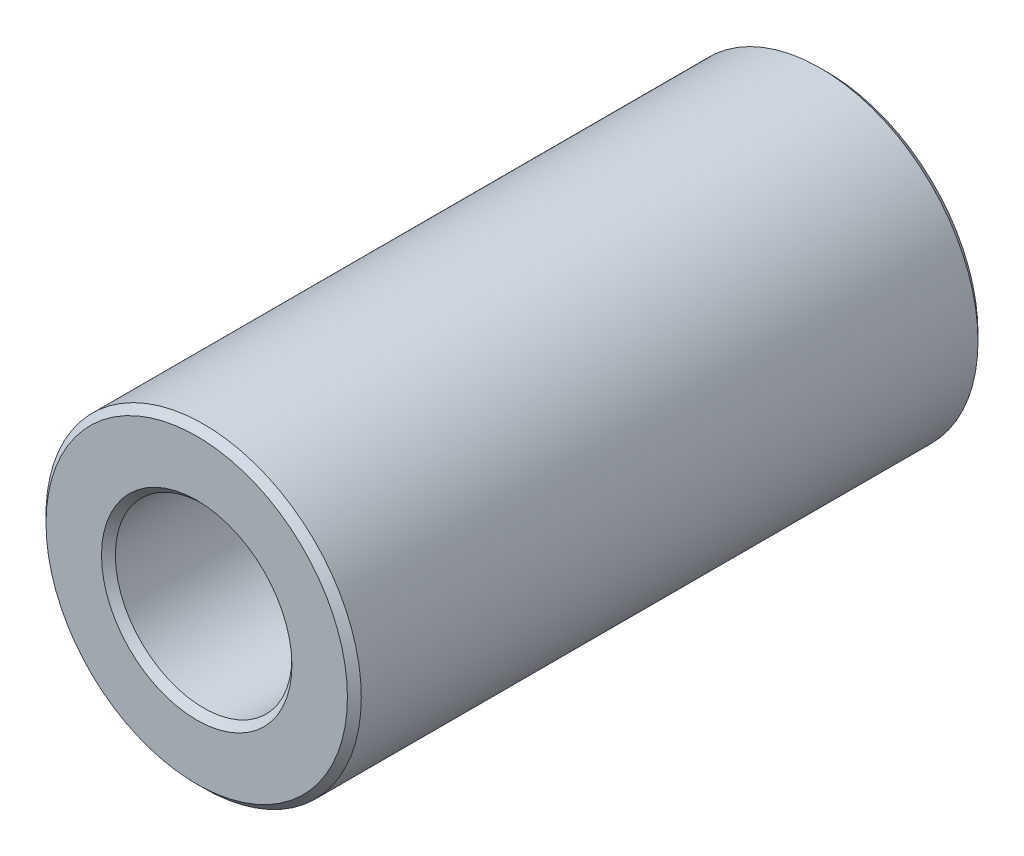
ISO-10303-21;
HEADER;
FILE_DESCRIPTION(('STEP AP214'),'2;1');
FILE_NAME('part.step','',(''),(''),'','','');
FILE_SCHEMA(('AUTOMOTIVE_DESIGN { 1 0 10303 214 1 1 1 1 }'));
ENDSEC;
DATA;
#1=APPLICATION_CONTEXT('core data for automotive mechanical design processes');
#2=APPLICATION_PROTOCOL_DEFINITION('international standard','automotive_design',2000,#1);
#3=PRODUCT_CONTEXT('',#1,'mechanical');
#4=PRODUCT('Part','Part','',(#3));
#5=PRODUCT_RELATED_PRODUCT_CATEGORY('part','',(#4));
#6=PRODUCT_DEFINITION_FORMATION('','',#4);
#7=PRODUCT_DEFINITION_CONTEXT('part definition',#1,'design');
#8=PRODUCT_DEFINITION('design','',#6,#7);
#9=PRODUCT_DEFINITION_SHAPE('','',#8);
#10=(LENGTH_UNIT() NAMED_UNIT(*) SI_UNIT(.MILLI.,.METRE.));
#11=(NAMED_UNIT(*) PLANE_ANGLE_UNIT() SI_UNIT($,.RADIAN.));
#12=(NAMED_UNIT(*) SI_UNIT($,.STERADIAN.) SOLID_ANGLE_UNIT());
#13=UNCERTAINTY_MEASURE_WITH_UNIT(LENGTH_MEASURE(1.E-05),#10,'distance_accuracy_value','');
#14=(GEOMETRIC_REPRESENTATION_CONTEXT(3) GLOBAL_UNCERTAINTY_ASSIGNED_CONTEXT((#13)) GLOBAL_UNIT_ASSIGNED_CONTEXT((#10,
#11,#12)) REPRESENTATION_CONTEXT('',''));
#15=CARTESIAN_POINT('',(0.,0.,0.));
#16=DIRECTION('',(0.,0.,1.));
#17=DIRECTION('',(1.,0.,0.));
#18=AXIS2_PLACEMENT_3D('',#15,#16,#17);
#19=CARTESIAN_POINT('',(0.,0.,-6.35));
#20=DIRECTION('',(0.,0.,1.));
#21=DIRECTION('',(1.,0.,0.));
#22=AXIS2_PLACEMENT_3D('',#19,#20,#21);
#23=CYLINDRICAL_SURFACE('',#22,3.175);
#24=CARTESIAN_POINT('',(0.,0.,6.2103));
#25=DIRECTION('',(0.,0.,1.));
#26=DIRECTION('',(1.,0.,0.));
#27=AXIS2_PLACEMENT_3D('',#24,#25,#26);
#28=CIRCLE('',#27,3.175);
#29=CARTESIAN_POINT('',(3.175,0.,6.2103));
#30=VERTEX_POINT('',#29);
#31=EDGE_CURVE('E54',#30,#30,#28,.F.);
#32=ORIENTED_EDGE('',*,*,#31,.T.);
#33=EDGE_LOOP('',(#32));
#34=FACE_BOUND('',#33,.T.);
#35=CARTESIAN_POINT('',(0.,0.,-6.2103));
#36=DIRECTION('',(0.,0.,1.));
#37=DIRECTION('',(1.,0.,0.));
#38=AXIS2_PLACEMENT_3D('',#35,#36,#37);
#39=CIRCLE('',#38,3.175);
#40=CARTESIAN_POINT('',(3.175,0.,-6.2103));
#41=VERTEX_POINT('',#40);
#42=EDGE_CURVE('E57',#41,#41,#39,.T.);
#43=ORIENTED_EDGE('',*,*,#42,.T.);
#44=EDGE_LOOP('',(#43));
#45=FACE_BOUND('',#44,.T.);
#46=ADVANCED_FACE('F34',(#34,#45),#23,.T.);
#47=CARTESIAN_POINT('',(0.,0.,-6.35));
#48=DIRECTION('',(0.,0.,1.));
#49=DIRECTION('',(1.,0.,0.));
#50=AXIS2_PLACEMENT_3D('',#47,#48,#49);
#51=PLANE('',#50);
#52=CARTESIAN_POINT('',(0.,0.,-6.35));
#53=DIRECTION('',(0.,0.,1.));
#54=DIRECTION('',(1.,0.,0.));
#55=AXIS2_PLACEMENT_3D('',#52,#53,#54);
#56=CIRCLE('',#55,3.0353);
#57=CARTESIAN_POINT('',(3.0353,0.,-6.35));
#58=VERTEX_POINT('',#57);
#59=EDGE_CURVE('E45',#58,#58,#56,.F.);
#60=ORIENTED_EDGE('',*,*,#59,.T.);
#61=EDGE_LOOP('',(#60));
#62=FACE_BOUND('',#61,.T.);
#63=CARTESIAN_POINT('',(0.,0.,-6.35));
#64=DIRECTION('',(0.,0.,1.));
#65=DIRECTION('',(1.,0.,0.));
#66=AXIS2_PLACEMENT_3D('',#63,#64,#65);
#67=CIRCLE('',#66,1.9177);
#68=CARTESIAN_POINT('',(1.9177,0.,-6.35));
#69=VERTEX_POINT('',#68);
#70=EDGE_CURVE('E49',#69,#69,#67,.T.);
#71=ORIENTED_EDGE('',*,*,#70,.T.);
#72=EDGE_LOOP('',(#71));
#73=FACE_BOUND('',#72,.T.);
#74=ADVANCED_FACE('F82',(#62,#73),#51,.F.);
#75=CARTESIAN_POINT('',(0.,0.,-6.35));
#76=DIRECTION('',(0.,0.,1.));
#77=DIRECTION('',(1.,0.,0.));
#78=AXIS2_PLACEMENT_3D('',#75,#76,#77);
#79=CYLINDRICAL_SURFACE('',#78,1.778);
#80=CARTESIAN_POINT('',(0.,0.,6.2103));
#81=DIRECTION('',(0.,0.,1.));
#82=DIRECTION('',(1.,0.,0.));
#83=AXIS2_PLACEMENT_3D('',#80,#81,#82);
#84=CIRCLE('',#83,1.778);
#85=CARTESIAN_POINT('',(1.778,0.,6.2103));
#86=VERTEX_POINT('',#85);
#87=EDGE_CURVE('E10',#86,#86,#84,.T.);
#88=CARTESIAN_POINT('',(0.,0.,-6.2103));
#89=DIRECTION('',(0.,0.,1.));
#90=DIRECTION('',(1.,0.,0.));
#91=AXIS2_PLACEMENT_3D('',#88,#89,#90);
#92=CIRCLE('',#91,1.778);
#93=CARTESIAN_POINT('',(1.778,0.,-6.2103));
#94=VERTEX_POINT('',#93);
#95=EDGE_CURVE('E41',#94,#94,#92,.F.);
#96=CARTESIAN_POINT('',(1.778,0.,6.2103));
#97=CARTESIAN_POINT('',(1.778,0.,6.08091875));
#98=CARTESIAN_POINT('',(1.778,0.,5.9515375));
#99=CARTESIAN_POINT('',(1.778,0.,5.692775));
#100=CARTESIAN_POINT('',(1.778,0.,5.56339375));
#101=CARTESIAN_POINT('',(1.778,0.,5.30463125));
#102=CARTESIAN_POINT('',(1.778,0.,5.17525));
#103=CARTESIAN_POINT('',(1.778,0.,4.9164875));
#104=CARTESIAN_POINT('',(1.778,0.,4.78710625));
#105=CARTESIAN_POINT('',(1.778,0.,4.52834375));
#106=CARTESIAN_POINT('',(1.778,0.,4.3989625));
#107=CARTESIAN_POINT('',(1.778,0.,4.1402));
#108=CARTESIAN_POINT('',(1.778,0.,4.01081875));
#109=CARTESIAN_POINT('',(1.778,0.,3.75205625));
#110=CARTESIAN_POINT('',(1.778,0.,3.622675));
#111=CARTESIAN_POINT('',(1.778,0.,3.3639125));
#112=CARTESIAN_POINT('',(1.778,0.,3.23453125));
#113=CARTESIAN_POINT('',(1.778,0.,2.97576875));
#114=CARTESIAN_POINT('',(1.778,0.,2.8463875));
#115=CARTESIAN_POINT('',(1.778,0.,2.587625));
#116=CARTESIAN_POINT('',(1.778,0.,2.45824375));
#117=CARTESIAN_POINT('',(1.778,0.,2.19948125));
#118=CARTESIAN_POINT('',(1.778,0.,2.0701));
#119=CARTESIAN_POINT('',(1.778,0.,1.8113375));
#120=CARTESIAN_POINT('',(1.778,0.,1.68195625));
#121=CARTESIAN_POINT('',(1.778,0.,1.42319375));
#122=CARTESIAN_POINT('',(1.778,0.,1.2938125));
#123=CARTESIAN_POINT('',(1.778,0.,1.03505));
#124=CARTESIAN_POINT('',(1.778,0.,0.90566875));
#125=CARTESIAN_POINT('',(1.778,0.,0.64690625));
#126=CARTESIAN_POINT('',(1.778,0.,0.517525));
#127=CARTESIAN_POINT('',(1.778,0.,0.2587625));
#128=CARTESIAN_POINT('',(1.778,0.,0.12938125));
#129=CARTESIAN_POINT('',(1.778,0.,-0.12938125));
#130=CARTESIAN_POINT('',(1.778,0.,-0.2587625));
#131=CARTESIAN_POINT('',(1.778,0.,-0.517525));
#132=CARTESIAN_POINT('',(1.778,0.,-0.64690625));
#133=CARTESIAN_POINT('',(1.778,0.,-0.90566875));
#134=CARTESIAN_POINT('',(1.778,0.,-1.03505));
#135=CARTESIAN_POINT('',(1.778,0.,-1.2938125));
#136=CARTESIAN_POINT('',(1.778,0.,-1.42319375));
#137=CARTESIAN_POINT('',(1.778,0.,-1.68195625));
#138=CARTESIAN_POINT('',(1.778,0.,-1.8113375));
#139=CARTESIAN_POINT('',(1.778,0.,-2.0701));
#140=CARTESIAN_POINT('',(1.778,0.,-2.19948125));
#141=CARTESIAN_POINT('',(1.778,0.,-2.45824375));
#142=CARTESIAN_POINT('',(1.778,0.,-2.587625));
#143=CARTESIAN_POINT('',(1.778,0.,-2.8463875));
#144=CARTESIAN_POINT('',(1.778,0.,-2.97576875));
#145=CARTESIAN_POINT('',(1.778,0.,-3.23453125));
#146=CARTESIAN_POINT('',(1.778,0.,-3.3639125));
#147=CARTESIAN_POINT('',(1.778,0.,-3.622675));
#148=CARTESIAN_POINT('',(1.778,0.,-3.75205625));
#149=CARTESIAN_POINT('',(1.778,0.,-4.01081875));
#150=CARTESIAN_POINT('',(1.778,0.,-4.1402));
#151=CARTESIAN_POINT('',(1.778,0.,-4.3989625));
#152=CARTESIAN_POINT('',(1.778,0.,-4.52834375));
#153=CARTESIAN_POINT('',(1.778,0.,-4.78710625));
#154=CARTESIAN_POINT('',(1.778,0.,-4.9164875));
#155=CARTESIAN_POINT('',(1.778,0.,-5.17525));
#156=CARTESIAN_POINT('',(1.778,0.,-5.30463125));
#157=CARTESIAN_POINT('',(1.778,0.,-5.56339375));
#158=CARTESIAN_POINT('',(1.778,0.,-5.692775));
#159=CARTESIAN_POINT('',(1.778,0.,-5.9515375));
#160=CARTESIAN_POINT('',(1.778,0.,-6.08091875));
#161=CARTESIAN_POINT('',(1.778,0.,-6.2103));
#162=B_SPLINE_CURVE_WITH_KNOTS('',3,(#96,#97,#98,#99,#100,#101,#102,#103,#104,#105,#106,#107,
#108,#109,#110,#111,#112,#113,#114,#115,#116,#117,#118,#119,#120,#121,#122,#123,#124,#125,#126,
#127,#128,#129,#130,#131,#132,#133,#134,#135,#136,#137,#138,#139,#140,#141,#142,#143,#144,#145,
#146,#147,#148,#149,#150,#151,#152,#153,#154,#155,#156,#157,#158,#159,#160,#161),.UNSPECIFIED.,
.F.,.F.,(4,2,2,2,2,2,2,2,2,2,2,2,2,2,2,2,2,2,2,2,2,2,2,2,2,2,2,2,2,2,2,2,4),(0.,0.38814375,
0.7762875,1.16443125,1.552575,1.94071875,2.3288625,2.71700625,3.10515,3.49329375,3.8814375,
4.26958125,4.657725,5.04586875,5.4340125,5.82215625,6.2103,6.59844375,6.9865875,7.37473125,
7.762875,8.15101875,8.5391625,8.92730625,9.31545,9.70359375,10.0917375,10.47988125,10.868025,
11.25616875,11.6443125,12.03245625,12.4206),.UNSPECIFIED.);
#163=EDGE_CURVE('BSEAM88',#86,#94,#162,.T.);
#164=ORIENTED_EDGE('',*,*,#87,.T.);
#165=ORIENTED_EDGE('',*,*,#95,.T.);
#166=ORIENTED_EDGE('',*,*,#163,.T.);
#167=ORIENTED_EDGE('',*,*,#163,.F.);
#168=EDGE_LOOP('',(#164,#166,#165,#167));
#169=FACE_BOUND('',#168,.T.);
#170=ADVANCED_FACE('F88',(#169),#79,.F.);
#171=CARTESIAN_POINT('',(0.,0.,6.35));
#172=DIRECTION('',(0.,0.,1.));
#173=DIRECTION('',(1.,0.,0.));
#174=AXIS2_PLACEMENT_3D('',#171,#172,#173);
#175=PLANE('',#174);
#176=CARTESIAN_POINT('',(0.,0.,6.35));
#177=DIRECTION('',(0.,0.,1.));
#178=DIRECTION('',(1.,0.,0.));
#179=AXIS2_PLACEMENT_3D('',#176,#177,#178);
#180=CIRCLE('',#179,3.0353);
#181=CARTESIAN_POINT('',(3.0353,0.,6.35));
#182=VERTEX_POINT('',#181);
#183=EDGE_CURVE('E60',#182,#182,#180,.T.);
#184=ORIENTED_EDGE('',*,*,#183,.T.);
#185=EDGE_LOOP('',(#184));
#186=FACE_BOUND('',#185,.T.);
#187=CARTESIAN_POINT('',(0.,0.,6.35));
#188=DIRECTION('',(0.,0.,1.));
#189=DIRECTION('',(1.,0.,0.));
#190=AXIS2_PLACEMENT_3D('',#187,#188,#189);
#191=CIRCLE('',#190,1.9177);
#192=CARTESIAN_POINT('',(1.9177,0.,6.35));
#193=VERTEX_POINT('',#192);
#194=EDGE_CURVE('E63',#193,#193,#191,.F.);
#195=ORIENTED_EDGE('',*,*,#194,.T.);
#196=EDGE_LOOP('',(#195));
#197=FACE_BOUND('',#196,.T.);
#198=ADVANCED_FACE('F67',(#186,#197),#175,.T.);
#199=CARTESIAN_POINT('',(0.,0.,6.35));
#200=DIRECTION('',(0.,0.,-1.));
#201=DIRECTION('',(-1.,0.,0.));
#202=AXIS2_PLACEMENT_3D('',#199,#200,#201);
#203=CONICAL_SURFACE('',#202,3.0353,0.785398163397445);
#204=ORIENTED_EDGE('',*,*,#31,.F.);
#205=EDGE_LOOP('',(#204));
#206=FACE_BOUND('',#205,.T.);
#207=ORIENTED_EDGE('',*,*,#183,.F.);
#208=EDGE_LOOP('',(#207));
#209=FACE_BOUND('',#208,.T.);
#210=ADVANCED_FACE('F78',(#206,#209),#203,.T.);
#211=CARTESIAN_POINT('',(0.,0.,-6.2103));
#212=DIRECTION('',(0.,0.,1.));
#213=DIRECTION('',(1.,0.,0.));
#214=AXIS2_PLACEMENT_3D('',#211,#212,#213);
#215=CONICAL_SURFACE('',#214,3.175,0.785398163397451);
#216=ORIENTED_EDGE('',*,*,#59,.F.);
#217=EDGE_LOOP('',(#216));
#218=FACE_BOUND('',#217,.T.);
#219=ORIENTED_EDGE('',*,*,#42,.F.);
#220=EDGE_LOOP('',(#219));
#221=FACE_BOUND('',#220,.T.);
#222=ADVANCED_FACE('F72',(#218,#221),#215,.T.);
#223=CARTESIAN_POINT('',(0.,0.,6.2103));
#224=DIRECTION('',(0.,0.,1.));
#225=DIRECTION('',(1.,0.,0.));
#226=AXIS2_PLACEMENT_3D('',#223,#224,#225);
#227=CONICAL_SURFACE('',#226,1.778,0.785398163397442);
#228=CARTESIAN_POINT('',(1.9177,0.,6.35));
#229=CARTESIAN_POINT('',(1.91624479166666,0.,6.34854479166667));
#230=CARTESIAN_POINT('',(1.91478958333333,0.,6.34708958333333));
#231=CARTESIAN_POINT('',(1.91187916666666,0.,6.34417916666667));
#232=CARTESIAN_POINT('',(1.91042395833333,0.,6.34272395833333));
#233=CARTESIAN_POINT('',(1.90751354166666,0.,6.33981354166667));
#234=CARTESIAN_POINT('',(1.90605833333333,0.,6.33835833333333));
#235=CARTESIAN_POINT('',(1.90314791666666,0.,6.33544791666667));
#236=CARTESIAN_POINT('',(1.90169270833333,0.,6.33399270833333));
#237=CARTESIAN_POINT('',(1.89878229166666,0.,6.33108229166667));
#238=CARTESIAN_POINT('',(1.89732708333333,0.,6.32962708333333));
#239=CARTESIAN_POINT('',(1.89441666666666,0.,6.32671666666667));
#240=CARTESIAN_POINT('',(1.89296145833333,0.,6.32526145833333));
#241=CARTESIAN_POINT('',(1.89005104166666,0.,6.32235104166667));
#242=CARTESIAN_POINT('',(1.88859583333333,0.,6.32089583333333));
#243=CARTESIAN_POINT('',(1.88568541666666,0.,6.31798541666667));
#244=CARTESIAN_POINT('',(1.88423020833333,0.,6.31653020833333));
#245=CARTESIAN_POINT('',(1.88131979166666,0.,6.31361979166667));
#246=CARTESIAN_POINT('',(1.87986458333333,0.,6.31216458333333));
#247=CARTESIAN_POINT('',(1.87695416666666,0.,6.30925416666667));
#248=CARTESIAN_POINT('',(1.87549895833333,0.,6.30779895833333));
#249=CARTESIAN_POINT('',(1.87258854166666,0.,6.30488854166667));
#250=CARTESIAN_POINT('',(1.87113333333333,0.,6.30343333333333));
#251=CARTESIAN_POINT('',(1.86822291666667,0.,6.30052291666667));
#252=CARTESIAN_POINT('',(1.86676770833333,0.,6.29906770833333));
#253=CARTESIAN_POINT('',(1.86385729166666,0.,6.29615729166667));
#254=CARTESIAN_POINT('',(1.86240208333333,0.,6.29470208333333));
#255=CARTESIAN_POINT('',(1.85949166666666,0.,6.29179166666667));
#256=CARTESIAN_POINT('',(1.85803645833333,0.,6.29033645833333));
#257=CARTESIAN_POINT('',(1.85512604166667,0.,6.28742604166667));
#258=CARTESIAN_POINT('',(1.85367083333333,0.,6.28597083333333));
#259=CARTESIAN_POINT('',(1.85076041666667,0.,6.28306041666667));
#260=CARTESIAN_POINT('',(1.84930520833333,0.,6.28160520833333));
#261=CARTESIAN_POINT('',(1.84639479166667,0.,6.27869479166667));
#262=CARTESIAN_POINT('',(1.84493958333333,0.,6.27723958333333));
#263=CARTESIAN_POINT('',(1.84202916666667,0.,6.27432916666667));
#264=CARTESIAN_POINT('',(1.84057395833333,0.,6.27287395833333));
#265=CARTESIAN_POINT('',(1.83766354166667,0.,6.26996354166667));
#266=CARTESIAN_POINT('',(1.83620833333333,0.,6.26850833333333));
#267=CARTESIAN_POINT('',(1.83329791666667,0.,6.26559791666667));
#268=CARTESIAN_POINT('',(1.83184270833333,0.,6.26414270833333));
#269=CARTESIAN_POINT('',(1.82893229166667,0.,6.26123229166667));
#270=CARTESIAN_POINT('',(1.82747708333333,0.,6.25977708333333));
#271=CARTESIAN_POINT('',(1.82456666666667,0.,6.25686666666667));
#272=CARTESIAN_POINT('',(1.82311145833333,0.,6.25541145833333));
#273=CARTESIAN_POINT('',(1.82020104166667,0.,6.25250104166667));
#274=CARTESIAN_POINT('',(1.81874583333333,0.,6.25104583333333));
#275=CARTESIAN_POINT('',(1.81583541666667,0.,6.24813541666667));
#276=CARTESIAN_POINT('',(1.81438020833333,0.,6.24668020833333));
#277=CARTESIAN_POINT('',(1.81146979166667,0.,6.24376979166667));
#278=CARTESIAN_POINT('',(1.81001458333333,0.,6.24231458333333));
#279=CARTESIAN_POINT('',(1.80710416666667,0.,6.23940416666667));
#280=CARTESIAN_POINT('',(1.80564895833333,0.,6.23794895833333));
#281=CARTESIAN_POINT('',(1.80273854166667,0.,6.23503854166667));
#282=CARTESIAN_POINT('',(1.80128333333333,0.,6.23358333333333));
#283=CARTESIAN_POINT('',(1.79837291666667,0.,6.23067291666667));
#284=CARTESIAN_POINT('',(1.79691770833333,0.,6.22921770833333));
#285=CARTESIAN_POINT('',(1.79400729166667,0.,6.22630729166667));
#286=CARTESIAN_POINT('',(1.79255208333333,0.,6.22485208333333));
#287=CARTESIAN_POINT('',(1.78964166666667,0.,6.22194166666667));
#288=CARTESIAN_POINT('',(1.78818645833333,0.,6.22048645833333));
#289=CARTESIAN_POINT('',(1.78527604166667,0.,6.21757604166667));
#290=CARTESIAN_POINT('',(1.78382083333333,0.,6.21612083333333));
#291=CARTESIAN_POINT('',(1.78091041666667,0.,6.21321041666667));
#292=CARTESIAN_POINT('',(1.77945520833333,0.,6.21175520833333));
#293=CARTESIAN_POINT('',(1.778,0.,6.2103));
#294=B_SPLINE_CURVE_WITH_KNOTS('',3,(#228,#229,#230,#231,#232,#233,#234,#235,#236,#237,#238,
#239,#240,#241,#242,#243,#244,#245,#246,#247,#248,#249,#250,#251,#252,#253,#254,#255,#256,#257,
#258,#259,#260,#261,#262,#263,#264,#265,#266,#267,#268,#269,#270,#271,#272,#273,#274,#275,#276,
#277,#278,#279,#280,#281,#282,#283,#284,#285,#286,#287,#288,#289,#290,#291,#292,#293),
.UNSPECIFIED.,.F.,.F.,(4,2,2,2,2,2,2,2,2,2,2,2,2,2,2,2,2,2,2,2,2,2,2,2,2,2,2,2,2,2,2,2,4),(0.,
0.00617392608323487,0.0123478521664697,0.0185217782497045,0.0246957043329399,0.0308696304161748,
0.0370435564994095,0.0432174825826444,0.0493914086658799,0.0555653347491148,0.0617392608323496,
0.0679131869155843,0.0740871129988198,0.0802610390820547,0.0864349651652894,0.0926088912485243,
0.0987828173317598,0.104956743414995,0.11113066949823,0.117304595581464,0.1234785216647,
0.129652447747935,0.135826373831169,0.142000299914404,0.14817422599764,0.154348152080874,
0.160522078164109,0.166696004247344,0.17286993033058,0.179043856413814,0.185217782497049,
0.191391708580284,0.197565634663519),.UNSPECIFIED.);
#295=EDGE_CURVE('BSEAM69',#193,#86,#294,.T.);
#296=ORIENTED_EDGE('',*,*,#194,.F.);
#297=ORIENTED_EDGE('',*,*,#87,.F.);
#298=ORIENTED_EDGE('',*,*,#295,.T.);
#299=ORIENTED_EDGE('',*,*,#295,.F.);
#300=EDGE_LOOP('',(#296,#298,#297,#299));
#301=FACE_BOUND('',#300,.T.);
#302=ADVANCED_FACE('F69',(#301),#227,.F.);
#303=CARTESIAN_POINT('',(0.,0.,-6.35));
#304=DIRECTION('',(0.,0.,-1.));
#305=DIRECTION('',(-1.,0.,0.));
#306=AXIS2_PLACEMENT_3D('',#303,#304,#305);
#307=CONICAL_SURFACE('',#306,1.9177,0.785398163397448);
#308=ORIENTED_EDGE('',*,*,#95,.F.);
#309=EDGE_LOOP('',(#308));
#310=FACE_BOUND('',#309,.T.);
#311=ORIENTED_EDGE('',*,*,#70,.F.);
#312=EDGE_LOOP('',(#311));
#313=FACE_BOUND('',#312,.T.);
#314=ADVANCED_FACE('F36',(#310,#313),#307,.F.);
#315=CLOSED_SHELL('',(#46,#74,#170,#198,#210,#222,#302,#314));
#316=MANIFOLD_SOLID_BREP('B2',#315);
#317=ADVANCED_BREP_SHAPE_REPRESENTATION('',(#18,#316),#14);
#318=SHAPE_DEFINITION_REPRESENTATION(#9,#317);
ENDSEC;
END-ISO-10303-21;
